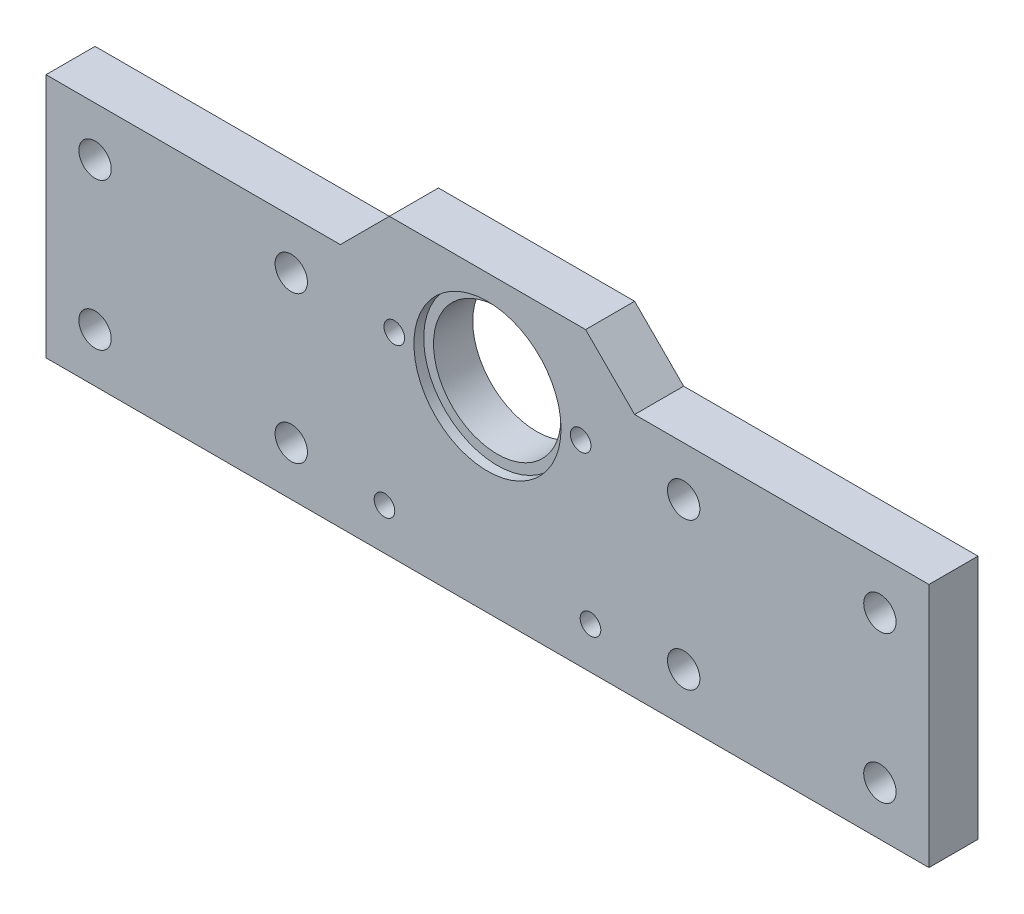
ISO-10303-21;
HEADER;
FILE_DESCRIPTION(('STEP AP214'),'2;1');
FILE_NAME('part.step','',(''),(''),'','','');
FILE_SCHEMA(('AUTOMOTIVE_DESIGN { 1 0 10303 214 1 1 1 1 }'));
ENDSEC;
DATA;
#1=APPLICATION_CONTEXT('core data for automotive mechanical design processes');
#2=APPLICATION_PROTOCOL_DEFINITION('international standard','automotive_design',2000,#1);
#3=PRODUCT_CONTEXT('',#1,'mechanical');
#4=PRODUCT('Part','Part','',(#3));
#5=PRODUCT_RELATED_PRODUCT_CATEGORY('part','',(#4));
#6=PRODUCT_DEFINITION_FORMATION('','',#4);
#7=PRODUCT_DEFINITION_CONTEXT('part definition',#1,'design');
#8=PRODUCT_DEFINITION('design','',#6,#7);
#9=PRODUCT_DEFINITION_SHAPE('','',#8);
#10=(LENGTH_UNIT() NAMED_UNIT(*) SI_UNIT(.MILLI.,.METRE.));
#11=(NAMED_UNIT(*) PLANE_ANGLE_UNIT() SI_UNIT($,.RADIAN.));
#12=(NAMED_UNIT(*) SI_UNIT($,.STERADIAN.) SOLID_ANGLE_UNIT());
#13=UNCERTAINTY_MEASURE_WITH_UNIT(LENGTH_MEASURE(1.E-05),#10,'distance_accuracy_value','');
#14=(GEOMETRIC_REPRESENTATION_CONTEXT(3) GLOBAL_UNCERTAINTY_ASSIGNED_CONTEXT((#13)) GLOBAL_UNIT_ASSIGNED_CONTEXT((#10,
#11,#12)) REPRESENTATION_CONTEXT('',''));
#15=CARTESIAN_POINT('',(0.,0.,0.));
#16=DIRECTION('',(0.,0.,1.));
#17=DIRECTION('',(1.,0.,0.));
#18=AXIS2_PLACEMENT_3D('',#15,#16,#17);
#19=CARTESIAN_POINT('',(45.,20.,-4.99999999997031E-05));
#20=DIRECTION('',(0.,0.,1.));
#21=DIRECTION('',(1.,0.,0.));
#22=AXIS2_PLACEMENT_3D('',#19,#20,#21);
#23=CYLINDRICAL_SURFACE('',#22,6.5);
#24=CARTESIAN_POINT('',(45.,20.,0.));
#25=DIRECTION('',(0.,0.,-1.));
#26=DIRECTION('',(-1.,0.,0.));
#27=AXIS2_PLACEMENT_3D('',#24,#25,#26);
#28=CIRCLE('',#27,6.5);
#29=CARTESIAN_POINT('',(38.5,20.,0.));
#30=VERTEX_POINT('',#29);
#31=EDGE_CURVE('E151',#30,#30,#28,.T.);
#32=ORIENTED_EDGE('',*,*,#31,.T.);
#33=EDGE_LOOP('',(#32));
#34=FACE_BOUND('',#33,.T.);
#35=CARTESIAN_POINT('',(45.,20.,4.));
#36=DIRECTION('',(0.,0.,1.));
#37=DIRECTION('',(1.,0.,0.));
#38=AXIS2_PLACEMENT_3D('',#35,#36,#37);
#39=CIRCLE('',#38,6.5);
#40=CARTESIAN_POINT('',(51.5,20.,4.));
#41=VERTEX_POINT('',#40);
#42=EDGE_CURVE('E39',#41,#41,#39,.F.);
#43=ORIENTED_EDGE('',*,*,#42,.F.);
#44=EDGE_LOOP('',(#43));
#45=FACE_BOUND('',#44,.T.);
#46=ADVANCED_FACE('F35',(#34,#45),#23,.F.);
#47=CARTESIAN_POINT('',(0.,25.,5.));
#48=DIRECTION('',(0.,-1.,0.));
#49=DIRECTION('',(0.,0.,-1.));
#50=AXIS2_PLACEMENT_3D('',#47,#48,#49);
#51=PLANE('',#50);
#52=DIRECTION('',(-1.,0.,0.));
#53=VECTOR('',#52,1.);
#54=CARTESIAN_POINT('',(0.,25.,5.));
#55=LINE('',#54,#53);
#56=CARTESIAN_POINT('',(30.,25.,5.));
#57=VERTEX_POINT('',#56);
#58=CARTESIAN_POINT('',(0.,25.,5.));
#59=VERTEX_POINT('',#58);
#60=EDGE_CURVE('E129',#57,#59,#55,.T.);
#61=ORIENTED_EDGE('',*,*,#60,.F.);
#62=DIRECTION('',(0.,0.,-1.));
#63=VECTOR('',#62,1.);
#64=CARTESIAN_POINT('',(30.,25.,5.));
#65=LINE('',#64,#63);
#66=CARTESIAN_POINT('',(30.,25.,0.));
#67=VERTEX_POINT('',#66);
#68=EDGE_CURVE('E57',#57,#67,#65,.T.);
#69=ORIENTED_EDGE('',*,*,#68,.T.);
#70=DIRECTION('',(-1.,0.,0.));
#71=VECTOR('',#70,1.);
#72=CARTESIAN_POINT('',(0.,25.,0.));
#73=LINE('',#72,#71);
#74=CARTESIAN_POINT('',(0.,25.,0.));
#75=VERTEX_POINT('',#74);
#76=EDGE_CURVE('E134',#67,#75,#73,.T.);
#77=ORIENTED_EDGE('',*,*,#76,.T.);
#78=DIRECTION('',(0.,0.,-1.));
#79=VECTOR('',#78,1.);
#80=CARTESIAN_POINT('',(0.,25.,5.));
#81=LINE('',#80,#79);
#82=EDGE_CURVE('E148',#59,#75,#81,.T.);
#83=ORIENTED_EDGE('',*,*,#82,.F.);
#84=EDGE_LOOP('',(#61,#69,#77,#83));
#85=FACE_BOUND('',#84,.T.);
#86=ADVANCED_FACE('F206',(#85),#51,.F.);
#87=CARTESIAN_POINT('',(0.,0.,5.));
#88=DIRECTION('',(1.,0.,0.));
#89=DIRECTION('',(0.,0.,-1.));
#90=AXIS2_PLACEMENT_3D('',#87,#88,#89);
#91=PLANE('',#90);
#92=DIRECTION('',(0.,-1.,0.));
#93=VECTOR('',#92,1.);
#94=CARTESIAN_POINT('',(0.,0.,0.));
#95=LINE('',#94,#93);
#96=CARTESIAN_POINT('',(0.,0.,0.));
#97=VERTEX_POINT('',#96);
#98=EDGE_CURVE('E141',#75,#97,#95,.T.);
#99=ORIENTED_EDGE('',*,*,#98,.T.);
#100=DIRECTION('',(0.,0.,-1.));
#101=VECTOR('',#100,1.);
#102=CARTESIAN_POINT('',(0.,0.,5.));
#103=LINE('',#102,#101);
#104=CARTESIAN_POINT('',(0.,0.,5.));
#105=VERTEX_POINT('',#104);
#106=EDGE_CURVE('E169',#105,#97,#103,.T.);
#107=ORIENTED_EDGE('',*,*,#106,.F.);
#108=DIRECTION('',(0.,-1.,0.));
#109=VECTOR('',#108,1.);
#110=CARTESIAN_POINT('',(0.,0.,5.));
#111=LINE('',#110,#109);
#112=EDGE_CURVE('E194',#59,#105,#111,.T.);
#113=ORIENTED_EDGE('',*,*,#112,.F.);
#114=ORIENTED_EDGE('',*,*,#82,.T.);
#115=EDGE_LOOP('',(#99,#107,#113,#114));
#116=FACE_BOUND('',#115,.T.);
#117=ADVANCED_FACE('F217',(#116),#91,.F.);
#118=CARTESIAN_POINT('',(0.,0.,5.));
#119=DIRECTION('',(0.,1.,0.));
#120=DIRECTION('',(0.,0.,1.));
#121=AXIS2_PLACEMENT_3D('',#118,#119,#120);
#122=PLANE('',#121);
#123=DIRECTION('',(1.,0.,0.));
#124=VECTOR('',#123,1.);
#125=CARTESIAN_POINT('',(0.,0.,0.));
#126=LINE('',#125,#124);
#127=CARTESIAN_POINT('',(90.,0.,0.));
#128=VERTEX_POINT('',#127);
#129=EDGE_CURVE('E188',#97,#128,#126,.T.);
#130=ORIENTED_EDGE('',*,*,#129,.T.);
#131=DIRECTION('',(0.,0.,-1.));
#132=VECTOR('',#131,1.);
#133=CARTESIAN_POINT('',(90.,0.,5.));
#134=LINE('',#133,#132);
#135=CARTESIAN_POINT('',(90.,0.,5.));
#136=VERTEX_POINT('',#135);
#137=EDGE_CURVE('E173',#136,#128,#134,.T.);
#138=ORIENTED_EDGE('',*,*,#137,.F.);
#139=DIRECTION('',(1.,0.,0.));
#140=VECTOR('',#139,1.);
#141=CARTESIAN_POINT('',(0.,0.,5.));
#142=LINE('',#141,#140);
#143=EDGE_CURVE('E196',#105,#136,#142,.T.);
#144=ORIENTED_EDGE('',*,*,#143,.F.);
#145=ORIENTED_EDGE('',*,*,#106,.T.);
#146=EDGE_LOOP('',(#130,#138,#144,#145));
#147=FACE_BOUND('',#146,.T.);
#148=ADVANCED_FACE('F213',(#147),#122,.F.);
#149=CARTESIAN_POINT('',(90.,0.,5.));
#150=DIRECTION('',(-1.,0.,0.));
#151=DIRECTION('',(0.,0.,1.));
#152=AXIS2_PLACEMENT_3D('',#149,#150,#151);
#153=PLANE('',#152);
#154=DIRECTION('',(0.,1.,0.));
#155=VECTOR('',#154,1.);
#156=CARTESIAN_POINT('',(90.,0.,0.));
#157=LINE('',#156,#155);
#158=CARTESIAN_POINT('',(90.,25.,0.));
#159=VERTEX_POINT('',#158);
#160=EDGE_CURVE('E186',#128,#159,#157,.T.);
#161=ORIENTED_EDGE('',*,*,#160,.T.);
#162=DIRECTION('',(0.,0.,-1.));
#163=VECTOR('',#162,1.);
#164=CARTESIAN_POINT('',(90.,25.,5.));
#165=LINE('',#164,#163);
#166=CARTESIAN_POINT('',(90.,25.,5.));
#167=VERTEX_POINT('',#166);
#168=EDGE_CURVE('E178',#167,#159,#165,.T.);
#169=ORIENTED_EDGE('',*,*,#168,.F.);
#170=DIRECTION('',(0.,1.,0.));
#171=VECTOR('',#170,1.);
#172=CARTESIAN_POINT('',(90.,0.,5.));
#173=LINE('',#172,#171);
#174=EDGE_CURVE('E133',#136,#167,#173,.T.);
#175=ORIENTED_EDGE('',*,*,#174,.F.);
#176=ORIENTED_EDGE('',*,*,#137,.T.);
#177=EDGE_LOOP('',(#161,#169,#175,#176));
#178=FACE_BOUND('',#177,.T.);
#179=ADVANCED_FACE('F201',(#178),#153,.F.);
#180=CARTESIAN_POINT('',(60.,25.,0.));
#181=VERTEX_POINT('',#180);
#182=EDGE_CURVE('E149',#159,#181,#73,.T.);
#183=ORIENTED_EDGE('',*,*,#182,.T.);
#184=DIRECTION('',(0.,0.,1.));
#185=VECTOR('',#184,1.);
#186=CARTESIAN_POINT('',(60.,25.,5.));
#187=LINE('',#186,#185);
#188=CARTESIAN_POINT('',(60.,25.,5.));
#189=VERTEX_POINT('',#188);
#190=EDGE_CURVE('E122',#181,#189,#187,.T.);
#191=ORIENTED_EDGE('',*,*,#190,.T.);
#192=EDGE_CURVE('E132',#167,#189,#55,.T.);
#193=ORIENTED_EDGE('',*,*,#192,.F.);
#194=ORIENTED_EDGE('',*,*,#168,.T.);
#195=EDGE_LOOP('',(#183,#191,#193,#194));
#196=FACE_BOUND('',#195,.T.);
#197=ADVANCED_FACE('F203',(#196),#51,.F.);
#198=CARTESIAN_POINT('',(0.,0.,5.));
#199=DIRECTION('',(0.,0.,-1.));
#200=DIRECTION('',(-1.,0.,0.));
#201=AXIS2_PLACEMENT_3D('',#198,#199,#200);
#202=PLANE('',#201);
#203=CARTESIAN_POINT('',(45.,20.,5.));
#204=DIRECTION('',(0.,0.,1.));
#205=DIRECTION('',(1.,0.,0.));
#206=AXIS2_PLACEMENT_3D('',#203,#204,#205);
#207=CIRCLE('',#206,7.5);
#208=CARTESIAN_POINT('',(52.5,20.,5.));
#209=VERTEX_POINT('',#208);
#210=EDGE_CURVE('E321',#209,#209,#207,.T.);
#211=ORIENTED_EDGE('',*,*,#210,.F.);
#212=EDGE_LOOP('',(#211));
#213=FACE_BOUND('',#212,.T.);
#214=CARTESIAN_POINT('',(85.,20.,5.));
#215=DIRECTION('',(0.,0.,1.));
#216=DIRECTION('',(-1.,0.,0.));
#217=AXIS2_PLACEMENT_3D('',#214,#215,#216);
#218=CIRCLE('',#217,1.65);
#219=CARTESIAN_POINT('',(83.35,20.,5.));
#220=VERTEX_POINT('',#219);
#221=EDGE_CURVE('E317',#220,#220,#218,.T.);
#222=ORIENTED_EDGE('',*,*,#221,.F.);
#223=EDGE_LOOP('',(#222));
#224=FACE_BOUND('',#223,.T.);
#225=CARTESIAN_POINT('',(65.,20.,5.));
#226=DIRECTION('',(0.,0.,1.));
#227=DIRECTION('',(-1.,0.,0.));
#228=AXIS2_PLACEMENT_3D('',#225,#226,#227);
#229=CIRCLE('',#228,1.65);
#230=CARTESIAN_POINT('',(63.35,20.,5.));
#231=VERTEX_POINT('',#230);
#232=EDGE_CURVE('E313',#231,#231,#229,.T.);
#233=ORIENTED_EDGE('',*,*,#232,.F.);
#234=EDGE_LOOP('',(#233));
#235=FACE_BOUND('',#234,.T.);
#236=CARTESIAN_POINT('',(65.,5.,5.));
#237=DIRECTION('',(0.,0.,1.));
#238=DIRECTION('',(1.,0.,0.));
#239=AXIS2_PLACEMENT_3D('',#236,#237,#238);
#240=CIRCLE('',#239,1.65);
#241=CARTESIAN_POINT('',(66.65,5.,5.));
#242=VERTEX_POINT('',#241);
#243=EDGE_CURVE('E309',#242,#242,#240,.T.);
#244=ORIENTED_EDGE('',*,*,#243,.F.);
#245=EDGE_LOOP('',(#244));
#246=FACE_BOUND('',#245,.T.);
#247=CARTESIAN_POINT('',(85.,4.99999999999999,5.));
#248=DIRECTION('',(0.,0.,1.));
#249=DIRECTION('',(1.,0.,0.));
#250=AXIS2_PLACEMENT_3D('',#247,#248,#249);
#251=CIRCLE('',#250,1.65);
#252=CARTESIAN_POINT('',(86.65,4.99999999999999,5.));
#253=VERTEX_POINT('',#252);
#254=EDGE_CURVE('E305',#253,#253,#251,.T.);
#255=ORIENTED_EDGE('',*,*,#254,.F.);
#256=EDGE_LOOP('',(#255));
#257=FACE_BOUND('',#256,.T.);
#258=CARTESIAN_POINT('',(5.,5.,5.));
#259=DIRECTION('',(0.,0.,1.));
#260=DIRECTION('',(-1.,0.,0.));
#261=AXIS2_PLACEMENT_3D('',#258,#259,#260);
#262=CIRCLE('',#261,1.65);
#263=CARTESIAN_POINT('',(3.35,5.,5.));
#264=VERTEX_POINT('',#263);
#265=EDGE_CURVE('E301',#264,#264,#262,.T.);
#266=ORIENTED_EDGE('',*,*,#265,.F.);
#267=EDGE_LOOP('',(#266));
#268=FACE_BOUND('',#267,.T.);
#269=CARTESIAN_POINT('',(25.,5.,5.));
#270=DIRECTION('',(0.,0.,1.));
#271=DIRECTION('',(-1.,0.,0.));
#272=AXIS2_PLACEMENT_3D('',#269,#270,#271);
#273=CIRCLE('',#272,1.65);
#274=CARTESIAN_POINT('',(23.35,5.,5.));
#275=VERTEX_POINT('',#274);
#276=EDGE_CURVE('E297',#275,#275,#273,.T.);
#277=ORIENTED_EDGE('',*,*,#276,.F.);
#278=EDGE_LOOP('',(#277));
#279=FACE_BOUND('',#278,.T.);
#280=CARTESIAN_POINT('',(25.,20.,5.));
#281=DIRECTION('',(0.,0.,1.));
#282=DIRECTION('',(1.,0.,0.));
#283=AXIS2_PLACEMENT_3D('',#280,#281,#282);
#284=CIRCLE('',#283,1.65);
#285=CARTESIAN_POINT('',(26.65,20.,5.));
#286=VERTEX_POINT('',#285);
#287=EDGE_CURVE('E293',#286,#286,#284,.T.);
#288=ORIENTED_EDGE('',*,*,#287,.F.);
#289=EDGE_LOOP('',(#288));
#290=FACE_BOUND('',#289,.T.);
#291=CARTESIAN_POINT('',(5.,20.,5.));
#292=DIRECTION('',(0.,0.,1.));
#293=DIRECTION('',(1.,0.,0.));
#294=AXIS2_PLACEMENT_3D('',#291,#292,#293);
#295=CIRCLE('',#294,1.65);
#296=CARTESIAN_POINT('',(6.65,20.,5.));
#297=VERTEX_POINT('',#296);
#298=EDGE_CURVE('E289',#297,#297,#295,.T.);
#299=ORIENTED_EDGE('',*,*,#298,.F.);
#300=EDGE_LOOP('',(#299));
#301=FACE_BOUND('',#300,.T.);
#302=CARTESIAN_POINT('',(54.5,20.,5.));
#303=DIRECTION('',(0.,0.,1.));
#304=DIRECTION('',(-1.,0.,0.));
#305=AXIS2_PLACEMENT_3D('',#302,#303,#304);
#306=CIRCLE('',#305,1.04999999999999);
#307=CARTESIAN_POINT('',(53.45,20.,5.));
#308=VERTEX_POINT('',#307);
#309=EDGE_CURVE('E168',#308,#308,#306,.T.);
#310=ORIENTED_EDGE('',*,*,#309,.F.);
#311=EDGE_LOOP('',(#310));
#312=FACE_BOUND('',#311,.T.);
#313=CARTESIAN_POINT('',(35.5,20.,5.));
#314=DIRECTION('',(0.,0.,1.));
#315=DIRECTION('',(1.,0.,0.));
#316=AXIS2_PLACEMENT_3D('',#313,#314,#315);
#317=CIRCLE('',#316,1.04999999999999);
#318=CARTESIAN_POINT('',(36.55,20.,5.));
#319=VERTEX_POINT('',#318);
#320=EDGE_CURVE('E165',#319,#319,#317,.T.);
#321=ORIENTED_EDGE('',*,*,#320,.F.);
#322=EDGE_LOOP('',(#321));
#323=FACE_BOUND('',#322,.T.);
#324=CARTESIAN_POINT('',(55.5,4.25,5.));
#325=DIRECTION('',(0.,0.,1.));
#326=DIRECTION('',(-1.,0.,0.));
#327=AXIS2_PLACEMENT_3D('',#324,#325,#326);
#328=CIRCLE('',#327,1.05);
#329=CARTESIAN_POINT('',(54.45,4.25,5.));
#330=VERTEX_POINT('',#329);
#331=EDGE_CURVE('E161',#330,#330,#328,.T.);
#332=ORIENTED_EDGE('',*,*,#331,.F.);
#333=EDGE_LOOP('',(#332));
#334=FACE_BOUND('',#333,.T.);
#335=CARTESIAN_POINT('',(34.5,4.25,5.));
#336=DIRECTION('',(0.,0.,1.));
#337=DIRECTION('',(1.,0.,0.));
#338=AXIS2_PLACEMENT_3D('',#335,#336,#337);
#339=CIRCLE('',#338,1.04999999999999);
#340=CARTESIAN_POINT('',(35.55,4.25,5.));
#341=VERTEX_POINT('',#340);
#342=EDGE_CURVE('E157',#341,#341,#339,.T.);
#343=ORIENTED_EDGE('',*,*,#342,.F.);
#344=EDGE_LOOP('',(#343));
#345=FACE_BOUND('',#344,.T.);
#346=ORIENTED_EDGE('',*,*,#112,.T.);
#347=ORIENTED_EDGE('',*,*,#143,.T.);
#348=ORIENTED_EDGE('',*,*,#174,.T.);
#349=ORIENTED_EDGE('',*,*,#192,.T.);
#350=DIRECTION('',(-0.707106781186552,0.707106781186543,0.));
#351=VECTOR('',#350,1.);
#352=CARTESIAN_POINT('',(42.4999999999996,42.5000000000002,5.));
#353=LINE('',#352,#351);
#354=CARTESIAN_POINT('',(55.,30.,5.));
#355=VERTEX_POINT('',#354);
#356=EDGE_CURVE('E123',#189,#355,#353,.T.);
#357=ORIENTED_EDGE('',*,*,#356,.T.);
#358=DIRECTION('',(-1.,0.,0.));
#359=VECTOR('',#358,1.);
#360=CARTESIAN_POINT('',(35.,30.,5.));
#361=LINE('',#360,#359);
#362=CARTESIAN_POINT('',(35.,30.,5.));
#363=VERTEX_POINT('',#362);
#364=EDGE_CURVE('E106',#355,#363,#361,.T.);
#365=ORIENTED_EDGE('',*,*,#364,.T.);
#366=DIRECTION('',(-0.707106781186544,-0.707106781186551,0.));
#367=VECTOR('',#366,1.);
#368=CARTESIAN_POINT('',(2.50000000000017,-2.50000000000015,5.));
#369=LINE('',#368,#367);
#370=EDGE_CURVE('E44',#363,#57,#369,.T.);
#371=ORIENTED_EDGE('',*,*,#370,.T.);
#372=ORIENTED_EDGE('',*,*,#60,.T.);
#373=EDGE_LOOP('',(#346,#347,#348,#349,#357,#365,#371,#372));
#374=FACE_BOUND('',#373,.T.);
#375=ADVANCED_FACE('F199',(#213,#224,#235,#246,#257,#268,#279,#290,#301,#312,#323,#334,#345,
#374),#202,.F.);
#376=CARTESIAN_POINT('',(0.,0.,0.));
#377=DIRECTION('',(0.,0.,-1.));
#378=DIRECTION('',(-1.,0.,0.));
#379=AXIS2_PLACEMENT_3D('',#376,#377,#378);
#380=PLANE('',#379);
#381=CARTESIAN_POINT('',(85.,20.,0.));
#382=DIRECTION('',(0.,0.,1.));
#383=DIRECTION('',(-1.,0.,0.));
#384=AXIS2_PLACEMENT_3D('',#381,#382,#383);
#385=CIRCLE('',#384,1.65);
#386=CARTESIAN_POINT('',(83.35,20.,0.));
#387=VERTEX_POINT('',#386);
#388=EDGE_CURVE('E236',#387,#387,#385,.T.);
#389=ORIENTED_EDGE('',*,*,#388,.T.);
#390=EDGE_LOOP('',(#389));
#391=FACE_BOUND('',#390,.T.);
#392=CARTESIAN_POINT('',(65.,20.,0.));
#393=DIRECTION('',(0.,0.,1.));
#394=DIRECTION('',(-1.,0.,0.));
#395=AXIS2_PLACEMENT_3D('',#392,#393,#394);
#396=CIRCLE('',#395,1.65);
#397=CARTESIAN_POINT('',(63.35,20.,0.));
#398=VERTEX_POINT('',#397);
#399=EDGE_CURVE('E240',#398,#398,#396,.T.);
#400=ORIENTED_EDGE('',*,*,#399,.T.);
#401=EDGE_LOOP('',(#400));
#402=FACE_BOUND('',#401,.T.);
#403=CARTESIAN_POINT('',(65.,5.,0.));
#404=DIRECTION('',(0.,0.,1.));
#405=DIRECTION('',(1.,0.,0.));
#406=AXIS2_PLACEMENT_3D('',#403,#404,#405);
#407=CIRCLE('',#406,1.65);
#408=CARTESIAN_POINT('',(66.65,5.,0.));
#409=VERTEX_POINT('',#408);
#410=EDGE_CURVE('E244',#409,#409,#407,.T.);
#411=ORIENTED_EDGE('',*,*,#410,.T.);
#412=EDGE_LOOP('',(#411));
#413=FACE_BOUND('',#412,.T.);
#414=CARTESIAN_POINT('',(85.,4.99999999999999,0.));
#415=DIRECTION('',(0.,0.,1.));
#416=DIRECTION('',(1.,0.,0.));
#417=AXIS2_PLACEMENT_3D('',#414,#415,#416);
#418=CIRCLE('',#417,1.65);
#419=CARTESIAN_POINT('',(86.65,4.99999999999999,0.));
#420=VERTEX_POINT('',#419);
#421=EDGE_CURVE('E248',#420,#420,#418,.T.);
#422=ORIENTED_EDGE('',*,*,#421,.T.);
#423=EDGE_LOOP('',(#422));
#424=FACE_BOUND('',#423,.T.);
#425=CARTESIAN_POINT('',(5.,5.,0.));
#426=DIRECTION('',(0.,0.,1.));
#427=DIRECTION('',(-1.,0.,0.));
#428=AXIS2_PLACEMENT_3D('',#425,#426,#427);
#429=CIRCLE('',#428,1.65);
#430=CARTESIAN_POINT('',(3.35,5.,0.));
#431=VERTEX_POINT('',#430);
#432=EDGE_CURVE('E252',#431,#431,#429,.T.);
#433=ORIENTED_EDGE('',*,*,#432,.T.);
#434=EDGE_LOOP('',(#433));
#435=FACE_BOUND('',#434,.T.);
#436=CARTESIAN_POINT('',(25.,5.,0.));
#437=DIRECTION('',(0.,0.,1.));
#438=DIRECTION('',(-1.,0.,0.));
#439=AXIS2_PLACEMENT_3D('',#436,#437,#438);
#440=CIRCLE('',#439,1.65);
#441=CARTESIAN_POINT('',(23.35,5.,0.));
#442=VERTEX_POINT('',#441);
#443=EDGE_CURVE('E256',#442,#442,#440,.T.);
#444=ORIENTED_EDGE('',*,*,#443,.T.);
#445=EDGE_LOOP('',(#444));
#446=FACE_BOUND('',#445,.T.);
#447=CARTESIAN_POINT('',(25.,20.,0.));
#448=DIRECTION('',(0.,0.,1.));
#449=DIRECTION('',(1.,0.,0.));
#450=AXIS2_PLACEMENT_3D('',#447,#448,#449);
#451=CIRCLE('',#450,1.65);
#452=CARTESIAN_POINT('',(26.65,20.,0.));
#453=VERTEX_POINT('',#452);
#454=EDGE_CURVE('E260',#453,#453,#451,.T.);
#455=ORIENTED_EDGE('',*,*,#454,.T.);
#456=EDGE_LOOP('',(#455));
#457=FACE_BOUND('',#456,.T.);
#458=CARTESIAN_POINT('',(5.,20.,0.));
#459=DIRECTION('',(0.,0.,1.));
#460=DIRECTION('',(1.,0.,0.));
#461=AXIS2_PLACEMENT_3D('',#458,#459,#460);
#462=CIRCLE('',#461,1.65);
#463=CARTESIAN_POINT('',(6.65,20.,0.));
#464=VERTEX_POINT('',#463);
#465=EDGE_CURVE('E264',#464,#464,#462,.T.);
#466=ORIENTED_EDGE('',*,*,#465,.T.);
#467=EDGE_LOOP('',(#466));
#468=FACE_BOUND('',#467,.T.);
#469=CARTESIAN_POINT('',(54.5,20.,0.));
#470=DIRECTION('',(0.,0.,-1.));
#471=DIRECTION('',(-1.,0.,0.));
#472=AXIS2_PLACEMENT_3D('',#469,#470,#471);
#473=CIRCLE('',#472,1.04999999999999);
#474=CARTESIAN_POINT('',(53.45,20.,0.));
#475=VERTEX_POINT('',#474);
#476=EDGE_CURVE('E166',#475,#475,#473,.T.);
#477=ORIENTED_EDGE('',*,*,#476,.F.);
#478=EDGE_LOOP('',(#477));
#479=FACE_BOUND('',#478,.T.);
#480=CARTESIAN_POINT('',(35.5,20.,0.));
#481=DIRECTION('',(0.,0.,-1.));
#482=DIRECTION('',(-1.,0.,0.));
#483=AXIS2_PLACEMENT_3D('',#480,#481,#482);
#484=CIRCLE('',#483,1.04999999999999);
#485=CARTESIAN_POINT('',(34.45,20.,0.));
#486=VERTEX_POINT('',#485);
#487=EDGE_CURVE('E162',#486,#486,#484,.T.);
#488=ORIENTED_EDGE('',*,*,#487,.F.);
#489=EDGE_LOOP('',(#488));
#490=FACE_BOUND('',#489,.T.);
#491=CARTESIAN_POINT('',(55.5,4.25,0.));
#492=DIRECTION('',(0.,0.,-1.));
#493=DIRECTION('',(-1.,0.,0.));
#494=AXIS2_PLACEMENT_3D('',#491,#492,#493);
#495=CIRCLE('',#494,1.05);
#496=CARTESIAN_POINT('',(54.45,4.25,0.));
#497=VERTEX_POINT('',#496);
#498=EDGE_CURVE('E158',#497,#497,#495,.T.);
#499=ORIENTED_EDGE('',*,*,#498,.F.);
#500=EDGE_LOOP('',(#499));
#501=FACE_BOUND('',#500,.T.);
#502=CARTESIAN_POINT('',(34.5,4.25,0.));
#503=DIRECTION('',(0.,0.,-1.));
#504=DIRECTION('',(-1.,0.,0.));
#505=AXIS2_PLACEMENT_3D('',#502,#503,#504);
#506=CIRCLE('',#505,1.04999999999999);
#507=CARTESIAN_POINT('',(33.45,4.25,0.));
#508=VERTEX_POINT('',#507);
#509=EDGE_CURVE('E154',#508,#508,#506,.T.);
#510=ORIENTED_EDGE('',*,*,#509,.F.);
#511=EDGE_LOOP('',(#510));
#512=FACE_BOUND('',#511,.T.);
#513=ORIENTED_EDGE('',*,*,#31,.F.);
#514=EDGE_LOOP('',(#513));
#515=FACE_BOUND('',#514,.T.);
#516=ORIENTED_EDGE('',*,*,#98,.F.);
#517=ORIENTED_EDGE('',*,*,#76,.F.);
#518=DIRECTION('',(0.707106781186544,0.707106781186551,0.));
#519=VECTOR('',#518,1.);
#520=CARTESIAN_POINT('',(35.,30.,0.));
#521=LINE('',#520,#519);
#522=CARTESIAN_POINT('',(35.,30.,0.));
#523=VERTEX_POINT('',#522);
#524=EDGE_CURVE('E11',#67,#523,#521,.T.);
#525=ORIENTED_EDGE('',*,*,#524,.T.);
#526=DIRECTION('',(-1.,0.,0.));
#527=VECTOR('',#526,1.);
#528=CARTESIAN_POINT('',(35.,30.,0.));
#529=LINE('',#528,#527);
#530=CARTESIAN_POINT('',(55.,30.,0.));
#531=VERTEX_POINT('',#530);
#532=EDGE_CURVE('E104',#531,#523,#529,.T.);
#533=ORIENTED_EDGE('',*,*,#532,.F.);
#534=DIRECTION('',(0.707106781186552,-0.707106781186543,0.));
#535=VECTOR('',#534,1.);
#536=CARTESIAN_POINT('',(60.,25.,0.));
#537=LINE('',#536,#535);
#538=EDGE_CURVE('E115',#531,#181,#537,.T.);
#539=ORIENTED_EDGE('',*,*,#538,.T.);
#540=ORIENTED_EDGE('',*,*,#182,.F.);
#541=ORIENTED_EDGE('',*,*,#160,.F.);
#542=ORIENTED_EDGE('',*,*,#129,.F.);
#543=EDGE_LOOP('',(#516,#517,#525,#533,#539,#540,#541,#542));
#544=FACE_BOUND('',#543,.T.);
#545=ADVANCED_FACE('F113',(#391,#402,#413,#424,#435,#446,#457,#468,#479,#490,#501,#512,#515,
#544),#380,.T.);
#546=CARTESIAN_POINT('',(35.,30.,0.));
#547=DIRECTION('',(0.,1.,0.));
#548=DIRECTION('',(0.,0.,1.));
#549=AXIS2_PLACEMENT_3D('',#546,#547,#548);
#550=PLANE('',#549);
#551=ORIENTED_EDGE('',*,*,#364,.F.);
#552=DIRECTION('',(0.,0.,1.));
#553=VECTOR('',#552,1.);
#554=CARTESIAN_POINT('',(55.,30.,0.));
#555=LINE('',#554,#553);
#556=EDGE_CURVE('E100',#531,#355,#555,.T.);
#557=ORIENTED_EDGE('',*,*,#556,.F.);
#558=ORIENTED_EDGE('',*,*,#532,.T.);
#559=DIRECTION('',(0.,0.,1.));
#560=VECTOR('',#559,1.);
#561=CARTESIAN_POINT('',(35.,30.,0.));
#562=LINE('',#561,#560);
#563=EDGE_CURVE('E109',#523,#363,#562,.T.);
#564=ORIENTED_EDGE('',*,*,#563,.T.);
#565=EDGE_LOOP('',(#551,#557,#558,#564));
#566=FACE_BOUND('',#565,.T.);
#567=ADVANCED_FACE('F102',(#566),#550,.T.);
#568=CARTESIAN_POINT('',(34.5,4.25,-4.99999999997031E-05));
#569=DIRECTION('',(0.,0.,1.));
#570=DIRECTION('',(1.,0.,0.));
#571=AXIS2_PLACEMENT_3D('',#568,#569,#570);
#572=CYLINDRICAL_SURFACE('',#571,1.04999999999999);
#573=ORIENTED_EDGE('',*,*,#509,.T.);
#574=EDGE_LOOP('',(#573));
#575=FACE_BOUND('',#574,.T.);
#576=ORIENTED_EDGE('',*,*,#342,.T.);
#577=EDGE_LOOP('',(#576));
#578=FACE_BOUND('',#577,.T.);
#579=ADVANCED_FACE('F226',(#575,#578),#572,.F.);
#580=CARTESIAN_POINT('',(55.5,4.25,-4.99999999997031E-05));
#581=DIRECTION('',(0.,0.,1.));
#582=DIRECTION('',(1.,0.,0.));
#583=AXIS2_PLACEMENT_3D('',#580,#581,#582);
#584=CYLINDRICAL_SURFACE('',#583,1.05);
#585=ORIENTED_EDGE('',*,*,#498,.T.);
#586=EDGE_LOOP('',(#585));
#587=FACE_BOUND('',#586,.T.);
#588=ORIENTED_EDGE('',*,*,#331,.T.);
#589=EDGE_LOOP('',(#588));
#590=FACE_BOUND('',#589,.T.);
#591=ADVANCED_FACE('F277',(#587,#590),#584,.F.);
#592=CARTESIAN_POINT('',(35.5,20.,-4.99999999997031E-05));
#593=DIRECTION('',(0.,0.,1.));
#594=DIRECTION('',(1.,0.,0.));
#595=AXIS2_PLACEMENT_3D('',#592,#593,#594);
#596=CYLINDRICAL_SURFACE('',#595,1.04999999999999);
#597=ORIENTED_EDGE('',*,*,#487,.T.);
#598=EDGE_LOOP('',(#597));
#599=FACE_BOUND('',#598,.T.);
#600=ORIENTED_EDGE('',*,*,#320,.T.);
#601=EDGE_LOOP('',(#600));
#602=FACE_BOUND('',#601,.T.);
#603=ADVANCED_FACE('F378',(#599,#602),#596,.F.);
#604=CARTESIAN_POINT('',(54.5,20.,-4.99999999997031E-05));
#605=DIRECTION('',(0.,0.,1.));
#606=DIRECTION('',(1.,0.,0.));
#607=AXIS2_PLACEMENT_3D('',#604,#605,#606);
#608=CYLINDRICAL_SURFACE('',#607,1.04999999999999);
#609=ORIENTED_EDGE('',*,*,#476,.T.);
#610=EDGE_LOOP('',(#609));
#611=FACE_BOUND('',#610,.T.);
#612=ORIENTED_EDGE('',*,*,#309,.T.);
#613=EDGE_LOOP('',(#612));
#614=FACE_BOUND('',#613,.T.);
#615=ADVANCED_FACE('F374',(#611,#614),#608,.F.);
#616=CARTESIAN_POINT('',(5.,20.,0.));
#617=DIRECTION('',(0.,0.,1.));
#618=DIRECTION('',(1.,0.,0.));
#619=AXIS2_PLACEMENT_3D('',#616,#617,#618);
#620=CYLINDRICAL_SURFACE('',#619,1.65);
#621=ORIENTED_EDGE('',*,*,#465,.F.);
#622=EDGE_LOOP('',(#621));
#623=FACE_BOUND('',#622,.T.);
#624=ORIENTED_EDGE('',*,*,#298,.T.);
#625=EDGE_LOOP('',(#624));
#626=FACE_BOUND('',#625,.T.);
#627=ADVANCED_FACE('F370',(#623,#626),#620,.F.);
#628=CARTESIAN_POINT('',(25.,20.,0.));
#629=DIRECTION('',(0.,0.,1.));
#630=DIRECTION('',(1.,0.,0.));
#631=AXIS2_PLACEMENT_3D('',#628,#629,#630);
#632=CYLINDRICAL_SURFACE('',#631,1.65);
#633=ORIENTED_EDGE('',*,*,#454,.F.);
#634=EDGE_LOOP('',(#633));
#635=FACE_BOUND('',#634,.T.);
#636=ORIENTED_EDGE('',*,*,#287,.T.);
#637=EDGE_LOOP('',(#636));
#638=FACE_BOUND('',#637,.T.);
#639=ADVANCED_FACE('F366',(#635,#638),#632,.F.);
#640=CARTESIAN_POINT('',(25.,5.,0.));
#641=DIRECTION('',(0.,0.,1.));
#642=DIRECTION('',(1.,0.,0.));
#643=AXIS2_PLACEMENT_3D('',#640,#641,#642);
#644=CYLINDRICAL_SURFACE('',#643,1.65);
#645=ORIENTED_EDGE('',*,*,#443,.F.);
#646=EDGE_LOOP('',(#645));
#647=FACE_BOUND('',#646,.T.);
#648=ORIENTED_EDGE('',*,*,#276,.T.);
#649=EDGE_LOOP('',(#648));
#650=FACE_BOUND('',#649,.T.);
#651=ADVANCED_FACE('F362',(#647,#650),#644,.F.);
#652=CARTESIAN_POINT('',(5.,5.,0.));
#653=DIRECTION('',(0.,0.,1.));
#654=DIRECTION('',(1.,0.,0.));
#655=AXIS2_PLACEMENT_3D('',#652,#653,#654);
#656=CYLINDRICAL_SURFACE('',#655,1.65);
#657=ORIENTED_EDGE('',*,*,#432,.F.);
#658=EDGE_LOOP('',(#657));
#659=FACE_BOUND('',#658,.T.);
#660=ORIENTED_EDGE('',*,*,#265,.T.);
#661=EDGE_LOOP('',(#660));
#662=FACE_BOUND('',#661,.T.);
#663=ADVANCED_FACE('F358',(#659,#662),#656,.F.);
#664=CARTESIAN_POINT('',(85.,4.99999999999999,0.));
#665=DIRECTION('',(0.,0.,1.));
#666=DIRECTION('',(1.,0.,0.));
#667=AXIS2_PLACEMENT_3D('',#664,#665,#666);
#668=CYLINDRICAL_SURFACE('',#667,1.65);
#669=ORIENTED_EDGE('',*,*,#421,.F.);
#670=EDGE_LOOP('',(#669));
#671=FACE_BOUND('',#670,.T.);
#672=ORIENTED_EDGE('',*,*,#254,.T.);
#673=EDGE_LOOP('',(#672));
#674=FACE_BOUND('',#673,.T.);
#675=ADVANCED_FACE('F354',(#671,#674),#668,.F.);
#676=CARTESIAN_POINT('',(65.,5.,0.));
#677=DIRECTION('',(0.,0.,1.));
#678=DIRECTION('',(1.,0.,0.));
#679=AXIS2_PLACEMENT_3D('',#676,#677,#678);
#680=CYLINDRICAL_SURFACE('',#679,1.65);
#681=ORIENTED_EDGE('',*,*,#410,.F.);
#682=EDGE_LOOP('',(#681));
#683=FACE_BOUND('',#682,.T.);
#684=ORIENTED_EDGE('',*,*,#243,.T.);
#685=EDGE_LOOP('',(#684));
#686=FACE_BOUND('',#685,.T.);
#687=ADVANCED_FACE('F350',(#683,#686),#680,.F.);
#688=CARTESIAN_POINT('',(65.,20.,0.));
#689=DIRECTION('',(0.,0.,1.));
#690=DIRECTION('',(1.,0.,0.));
#691=AXIS2_PLACEMENT_3D('',#688,#689,#690);
#692=CYLINDRICAL_SURFACE('',#691,1.65);
#693=ORIENTED_EDGE('',*,*,#399,.F.);
#694=EDGE_LOOP('',(#693));
#695=FACE_BOUND('',#694,.T.);
#696=ORIENTED_EDGE('',*,*,#232,.T.);
#697=EDGE_LOOP('',(#696));
#698=FACE_BOUND('',#697,.T.);
#699=ADVANCED_FACE('F346',(#695,#698),#692,.F.);
#700=CARTESIAN_POINT('',(85.,20.,0.));
#701=DIRECTION('',(0.,0.,1.));
#702=DIRECTION('',(1.,0.,0.));
#703=AXIS2_PLACEMENT_3D('',#700,#701,#702);
#704=CYLINDRICAL_SURFACE('',#703,1.65);
#705=ORIENTED_EDGE('',*,*,#388,.F.);
#706=EDGE_LOOP('',(#705));
#707=FACE_BOUND('',#706,.T.);
#708=ORIENTED_EDGE('',*,*,#221,.T.);
#709=EDGE_LOOP('',(#708));
#710=FACE_BOUND('',#709,.T.);
#711=ADVANCED_FACE('F343',(#707,#710),#704,.F.);
#712=CARTESIAN_POINT('',(60.,25.,5.));
#713=DIRECTION('',(-0.707106781186543,-0.707106781186552,0.));
#714=DIRECTION('',(0.,0.,1.));
#715=AXIS2_PLACEMENT_3D('',#712,#713,#714);
#716=PLANE('',#715);
#717=ORIENTED_EDGE('',*,*,#538,.F.);
#718=ORIENTED_EDGE('',*,*,#556,.T.);
#719=ORIENTED_EDGE('',*,*,#356,.F.);
#720=ORIENTED_EDGE('',*,*,#190,.F.);
#721=EDGE_LOOP('',(#717,#718,#719,#720));
#722=FACE_BOUND('',#721,.T.);
#723=ADVANCED_FACE('F120',(#722),#716,.F.);
#724=CARTESIAN_POINT('',(35.,30.,0.));
#725=DIRECTION('',(0.707106781186551,-0.707106781186544,0.));
#726=DIRECTION('',(0.,0.,1.));
#727=AXIS2_PLACEMENT_3D('',#724,#725,#726);
#728=PLANE('',#727);
#729=ORIENTED_EDGE('',*,*,#524,.F.);
#730=ORIENTED_EDGE('',*,*,#68,.F.);
#731=ORIENTED_EDGE('',*,*,#370,.F.);
#732=ORIENTED_EDGE('',*,*,#563,.F.);
#733=EDGE_LOOP('',(#729,#730,#731,#732));
#734=FACE_BOUND('',#733,.T.);
#735=ADVANCED_FACE('F37',(#734),#728,.F.);
#736=CARTESIAN_POINT('',(45.,20.,4.));
#737=DIRECTION('',(0.,0.,1.));
#738=DIRECTION('',(1.,0.,0.));
#739=AXIS2_PLACEMENT_3D('',#736,#737,#738);
#740=PLANE('',#739);
#741=CARTESIAN_POINT('',(45.,20.,4.));
#742=DIRECTION('',(0.,0.,1.));
#743=DIRECTION('',(1.,0.,0.));
#744=AXIS2_PLACEMENT_3D('',#741,#742,#743);
#745=CIRCLE('',#744,7.5);
#746=CARTESIAN_POINT('',(52.5,20.,4.));
#747=VERTEX_POINT('',#746);
#748=EDGE_CURVE('E324',#747,#747,#745,.T.);
#749=ORIENTED_EDGE('',*,*,#748,.T.);
#750=EDGE_LOOP('',(#749));
#751=FACE_BOUND('',#750,.T.);
#752=ORIENTED_EDGE('',*,*,#42,.T.);
#753=EDGE_LOOP('',(#752));
#754=FACE_BOUND('',#753,.T.);
#755=ADVANCED_FACE('F331',(#751,#754),#740,.T.);
#756=CARTESIAN_POINT('',(45.,20.,4.));
#757=DIRECTION('',(0.,0.,1.));
#758=DIRECTION('',(1.,0.,0.));
#759=AXIS2_PLACEMENT_3D('',#756,#757,#758);
#760=CYLINDRICAL_SURFACE('',#759,7.5);
#761=ORIENTED_EDGE('',*,*,#748,.F.);
#762=EDGE_LOOP('',(#761));
#763=FACE_BOUND('',#762,.T.);
#764=ORIENTED_EDGE('',*,*,#210,.T.);
#765=EDGE_LOOP('',(#764));
#766=FACE_BOUND('',#765,.T.);
#767=ADVANCED_FACE('F333',(#763,#766),#760,.F.);
#768=CLOSED_SHELL('',(#46,#86,#117,#148,#179,#197,#375,#545,#567,#579,#591,#603,#615,#627,#639,
#651,#663,#675,#687,#699,#711,#723,#735,#755,#767));
#769=MANIFOLD_SOLID_BREP('B2',#768);
#770=ADVANCED_BREP_SHAPE_REPRESENTATION('',(#18,#769),#14);
#771=SHAPE_DEFINITION_REPRESENTATION(#9,#770);
ENDSEC;
END-ISO-10303-21;
